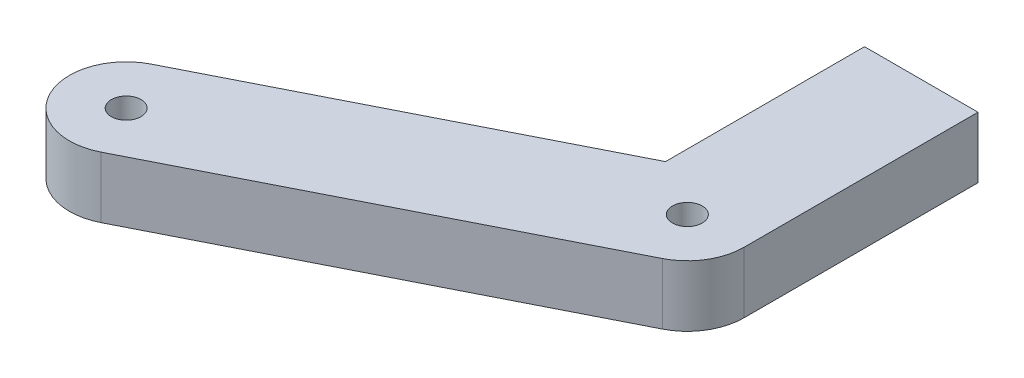
ISO-10303-21;
HEADER;
FILE_DESCRIPTION(('STEP AP214'),'2;1');
FILE_NAME('part.step','',(''),(''),'','','');
FILE_SCHEMA(('AUTOMOTIVE_DESIGN { 1 0 10303 214 1 1 1 1 }'));
ENDSEC;
DATA;
#1=APPLICATION_CONTEXT('core data for automotive mechanical design processes');
#2=APPLICATION_PROTOCOL_DEFINITION('international standard','automotive_design',2000,#1);
#3=PRODUCT_CONTEXT('',#1,'mechanical');
#4=PRODUCT('Part','Part','',(#3));
#5=PRODUCT_RELATED_PRODUCT_CATEGORY('part','',(#4));
#6=PRODUCT_DEFINITION_FORMATION('','',#4);
#7=PRODUCT_DEFINITION_CONTEXT('part definition',#1,'design');
#8=PRODUCT_DEFINITION('design','',#6,#7);
#9=PRODUCT_DEFINITION_SHAPE('','',#8);
#10=(LENGTH_UNIT() NAMED_UNIT(*) SI_UNIT(.MILLI.,.METRE.));
#11=(NAMED_UNIT(*) PLANE_ANGLE_UNIT() SI_UNIT($,.RADIAN.));
#12=(NAMED_UNIT(*) SI_UNIT($,.STERADIAN.) SOLID_ANGLE_UNIT());
#13=UNCERTAINTY_MEASURE_WITH_UNIT(LENGTH_MEASURE(1.E-05),#10,'distance_accuracy_value','');
#14=(GEOMETRIC_REPRESENTATION_CONTEXT(3) GLOBAL_UNCERTAINTY_ASSIGNED_CONTEXT((#13)) GLOBAL_UNIT_ASSIGNED_CONTEXT((#10,
#11,#12)) REPRESENTATION_CONTEXT('',''));
#15=CARTESIAN_POINT('',(0.,0.,0.));
#16=DIRECTION('',(0.,0.,1.));
#17=DIRECTION('',(1.,0.,0.));
#18=AXIS2_PLACEMENT_3D('',#15,#16,#17);
#19=CARTESIAN_POINT('',(-12.4416435833277,7.,-24.6066781381809));
#20=DIRECTION('',(-0.451221813161748,0.,-0.892411830562003));
#21=DIRECTION('',(-0.892411830562003,0.,0.451221813161748));
#22=AXIS2_PLACEMENT_3D('',#19,#20,#21);
#23=PLANE('',#22);
#24=DIRECTION('',(0.892411830562003,0.,-0.451221813161748));
#25=VECTOR('',#24,1.);
#26=CARTESIAN_POINT('',(-12.4416435833277,0.,-24.6066781381809));
#27=LINE('',#26,#25);
#28=CARTESIAN_POINT('',(-11.7902923796233,0.,-24.9360147304082));
#29=VERTEX_POINT('',#28);
#30=CARTESIAN_POINT('',(30.9097076192638,0.,-46.5260147300393));
#31=VERTEX_POINT('',#30);
#32=EDGE_CURVE('E149',#29,#31,#27,.T.);
#33=ORIENTED_EDGE('',*,*,#32,.T.);
#34=DIRECTION('',(0.,-1.,0.));
#35=VECTOR('',#34,1.);
#36=CARTESIAN_POINT('',(30.9097076192638,7.,-46.5260147300393));
#37=LINE('',#36,#35);
#38=CARTESIAN_POINT('',(30.9097076192638,7.,-46.5260147300393));
#39=VERTEX_POINT('',#38);
#40=EDGE_CURVE('E11',#39,#31,#37,.T.);
#41=ORIENTED_EDGE('',*,*,#40,.F.);
#42=DIRECTION('',(0.892411830562003,0.,-0.451221813161748));
#43=VECTOR('',#42,1.);
#44=CARTESIAN_POINT('',(-12.4416435833277,7.,-24.6066781381809));
#45=LINE('',#44,#43);
#46=CARTESIAN_POINT('',(-11.7902923796233,7.,-24.9360147304082));
#47=VERTEX_POINT('',#46);
#48=EDGE_CURVE('E179',#47,#39,#45,.T.);
#49=ORIENTED_EDGE('',*,*,#48,.F.);
#50=DIRECTION('',(0.,-1.,0.));
#51=VECTOR('',#50,1.);
#52=CARTESIAN_POINT('',(-11.7902923796233,7.,-24.9360147304082));
#53=LINE('',#52,#51);
#54=EDGE_CURVE('E148',#47,#29,#53,.T.);
#55=ORIENTED_EDGE('',*,*,#54,.T.);
#56=EDGE_LOOP('',(#33,#41,#49,#55));
#57=FACE_BOUND('',#56,.T.);
#58=ADVANCED_FACE('F47',(#57),#23,.F.);
#59=CARTESIAN_POINT('',(27.9767658337124,7.,-52.3266916286923));
#60=DIRECTION('',(0.,-1.,0.));
#61=DIRECTION('',(0.,0.,-1.));
#62=AXIS2_PLACEMENT_3D('',#59,#60,#61);
#63=CYLINDRICAL_SURFACE('',#62,6.5);
#64=CARTESIAN_POINT('',(27.9767658337124,0.,-52.3266916286923));
#65=DIRECTION('',(0.,1.,0.));
#66=DIRECTION('',(0.,0.,1.));
#67=AXIS2_PLACEMENT_3D('',#64,#65,#66);
#68=CIRCLE('',#67,6.5);
#69=CARTESIAN_POINT('',(34.4767658337124,0.,-52.3266916286923));
#70=VERTEX_POINT('',#69);
#71=EDGE_CURVE('E153',#31,#70,#68,.T.);
#72=ORIENTED_EDGE('',*,*,#71,.T.);
#73=DIRECTION('',(0.,-1.,0.));
#74=VECTOR('',#73,1.);
#75=CARTESIAN_POINT('',(34.4767658337124,7.,-52.3266916286923));
#76=LINE('',#75,#74);
#77=CARTESIAN_POINT('',(34.4767658337124,7.,-52.3266916286923));
#78=VERTEX_POINT('',#77);
#79=EDGE_CURVE('E56',#78,#70,#76,.T.);
#80=ORIENTED_EDGE('',*,*,#79,.F.);
#81=CARTESIAN_POINT('',(27.9767658337124,7.,-52.3266916286923));
#82=DIRECTION('',(0.,1.,0.));
#83=DIRECTION('',(0.,0.,1.));
#84=AXIS2_PLACEMENT_3D('',#81,#82,#83);
#85=CIRCLE('',#84,6.5);
#86=EDGE_CURVE('E100',#39,#78,#85,.T.);
#87=ORIENTED_EDGE('',*,*,#86,.F.);
#88=ORIENTED_EDGE('',*,*,#40,.T.);
#89=EDGE_LOOP('',(#72,#80,#87,#88));
#90=FACE_BOUND('',#89,.T.);
#91=ADVANCED_FACE('F213',(#90),#63,.T.);
#92=CARTESIAN_POINT('',(34.4767658337124,7.,0.));
#93=DIRECTION('',(-1.,0.,0.));
#94=DIRECTION('',(0.,0.,1.));
#95=AXIS2_PLACEMENT_3D('',#92,#93,#94);
#96=PLANE('',#95);
#97=DIRECTION('',(0.,0.,-1.));
#98=VECTOR('',#97,1.);
#99=CARTESIAN_POINT('',(34.4767658337124,0.,0.));
#100=LINE('',#99,#98);
#101=CARTESIAN_POINT('',(34.4767658337124,0.,-79.124442117256));
#102=VERTEX_POINT('',#101);
#103=EDGE_CURVE('E156',#70,#102,#100,.T.);
#104=ORIENTED_EDGE('',*,*,#103,.T.);
#105=DIRECTION('',(0.,-1.,0.));
#106=VECTOR('',#105,1.);
#107=CARTESIAN_POINT('',(34.4767658337124,7.,-79.124442117256));
#108=LINE('',#107,#106);
#109=CARTESIAN_POINT('',(34.4767658337124,7.,-79.124442117256));
#110=VERTEX_POINT('',#109);
#111=EDGE_CURVE('E186',#110,#102,#108,.T.);
#112=ORIENTED_EDGE('',*,*,#111,.F.);
#113=DIRECTION('',(0.,0.,-1.));
#114=VECTOR('',#113,1.);
#115=CARTESIAN_POINT('',(34.4767658337124,7.,0.));
#116=LINE('',#115,#114);
#117=EDGE_CURVE('E195',#78,#110,#116,.T.);
#118=ORIENTED_EDGE('',*,*,#117,.F.);
#119=ORIENTED_EDGE('',*,*,#79,.T.);
#120=EDGE_LOOP('',(#104,#112,#118,#119));
#121=FACE_BOUND('',#120,.T.);
#122=ADVANCED_FACE('F193',(#121),#96,.F.);
#123=CARTESIAN_POINT('',(0.,7.,-79.124442117256));
#124=DIRECTION('',(0.,0.,-1.));
#125=DIRECTION('',(-1.,0.,0.));
#126=AXIS2_PLACEMENT_3D('',#123,#124,#125);
#127=PLANE('',#126);
#128=DIRECTION('',(1.,0.,0.));
#129=VECTOR('',#128,1.);
#130=CARTESIAN_POINT('',(0.,0.,-79.124442117256));
#131=LINE('',#130,#129);
#132=CARTESIAN_POINT('',(21.4767658337124,0.,-79.124442117256));
#133=VERTEX_POINT('',#132);
#134=EDGE_CURVE('E160',#133,#102,#131,.T.);
#135=ORIENTED_EDGE('',*,*,#134,.F.);
#136=DIRECTION('',(0.,-1.,0.));
#137=VECTOR('',#136,1.);
#138=CARTESIAN_POINT('',(21.4767658337124,7.,-79.124442117256));
#139=LINE('',#138,#137);
#140=CARTESIAN_POINT('',(21.4767658337124,7.,-79.124442117256));
#141=VERTEX_POINT('',#140);
#142=EDGE_CURVE('E123',#141,#133,#139,.T.);
#143=ORIENTED_EDGE('',*,*,#142,.F.);
#144=DIRECTION('',(1.,0.,0.));
#145=VECTOR('',#144,1.);
#146=CARTESIAN_POINT('',(0.,7.,-79.124442117256));
#147=LINE('',#146,#145);
#148=EDGE_CURVE('E130',#141,#110,#147,.T.);
#149=ORIENTED_EDGE('',*,*,#148,.T.);
#150=ORIENTED_EDGE('',*,*,#111,.T.);
#151=EDGE_LOOP('',(#135,#143,#149,#150));
#152=FACE_BOUND('',#151,.T.);
#153=ADVANCED_FACE('F202',(#152),#127,.T.);
#154=CARTESIAN_POINT('',(21.4767658337124,7.,0.));
#155=DIRECTION('',(-1.,0.,0.));
#156=DIRECTION('',(0.,0.,1.));
#157=AXIS2_PLACEMENT_3D('',#154,#155,#156);
#158=PLANE('',#157);
#159=DIRECTION('',(0.,0.,-1.));
#160=VECTOR('',#159,1.);
#161=CARTESIAN_POINT('',(21.4767658337124,0.,0.));
#162=LINE('',#161,#160);
#163=CARTESIAN_POINT('',(21.4767658337124,0.,-56.3237903809603));
#164=VERTEX_POINT('',#163);
#165=EDGE_CURVE('E117',#164,#133,#162,.T.);
#166=ORIENTED_EDGE('',*,*,#165,.F.);
#167=DIRECTION('',(0.,-1.,0.));
#168=VECTOR('',#167,1.);
#169=CARTESIAN_POINT('',(21.4767658337124,7.,-56.3237903809603));
#170=LINE('',#169,#168);
#171=CARTESIAN_POINT('',(21.4767658337124,7.,-56.3237903809603));
#172=VERTEX_POINT('',#171);
#173=EDGE_CURVE('E112',#172,#164,#170,.T.);
#174=ORIENTED_EDGE('',*,*,#173,.F.);
#175=DIRECTION('',(0.,0.,-1.));
#176=VECTOR('',#175,1.);
#177=CARTESIAN_POINT('',(21.4767658337124,7.,0.));
#178=LINE('',#177,#176);
#179=EDGE_CURVE('E115',#172,#141,#178,.T.);
#180=ORIENTED_EDGE('',*,*,#179,.T.);
#181=ORIENTED_EDGE('',*,*,#142,.T.);
#182=EDGE_LOOP('',(#166,#174,#180,#181));
#183=FACE_BOUND('',#182,.T.);
#184=ADVANCED_FACE('F114',(#183),#158,.T.);
#185=CARTESIAN_POINT('',(-18.3075271544305,7.,-36.2080319354869));
#186=DIRECTION('',(-0.451221813161747,0.,-0.892411830562003));
#187=DIRECTION('',(-0.892411830562003,0.,0.451221813161747));
#188=AXIS2_PLACEMENT_3D('',#185,#186,#187);
#189=PLANE('',#188);
#190=DIRECTION('',(0.892411830562003,0.,-0.451221813161747));
#191=VECTOR('',#190,1.);
#192=CARTESIAN_POINT('',(-18.3075271544305,0.,-36.2080319354869));
#193=LINE('',#192,#191);
#194=CARTESIAN_POINT('',(-17.656175950726,0.,-36.5373685277142));
#195=VERTEX_POINT('',#194);
#196=EDGE_CURVE('E166',#195,#164,#193,.T.);
#197=ORIENTED_EDGE('',*,*,#196,.F.);
#198=DIRECTION('',(0.,-1.,0.));
#199=VECTOR('',#198,1.);
#200=CARTESIAN_POINT('',(-17.656175950726,7.,-36.5373685277142));
#201=LINE('',#200,#199);
#202=CARTESIAN_POINT('',(-17.656175950726,7.,-36.5373685277142));
#203=VERTEX_POINT('',#202);
#204=EDGE_CURVE('E89',#203,#195,#201,.T.);
#205=ORIENTED_EDGE('',*,*,#204,.F.);
#206=DIRECTION('',(0.892411830562003,0.,-0.451221813161747));
#207=VECTOR('',#206,1.);
#208=CARTESIAN_POINT('',(-18.3075271544305,7.,-36.2080319354869));
#209=LINE('',#208,#207);
#210=EDGE_CURVE('E128',#203,#172,#209,.T.);
#211=ORIENTED_EDGE('',*,*,#210,.T.);
#212=ORIENTED_EDGE('',*,*,#173,.T.);
#213=EDGE_LOOP('',(#197,#205,#211,#212));
#214=FACE_BOUND('',#213,.T.);
#215=ADVANCED_FACE('F133',(#214),#189,.T.);
#216=CARTESIAN_POINT('',(-14.7232341651746,7.,-30.7366916290612));
#217=DIRECTION('',(0.,-1.,0.));
#218=DIRECTION('',(0.,0.,-1.));
#219=AXIS2_PLACEMENT_3D('',#216,#217,#218);
#220=CYLINDRICAL_SURFACE('',#219,1.7);
#221=CARTESIAN_POINT('',(-14.7232341651746,7.,-30.7366916290612));
#222=DIRECTION('',(0.,1.,0.));
#223=DIRECTION('',(0.,0.,1.));
#224=AXIS2_PLACEMENT_3D('',#221,#222,#223);
#225=CIRCLE('',#224,1.7);
#226=CARTESIAN_POINT('',(-14.7232341651746,7.,-29.0366916290612));
#227=VERTEX_POINT('',#226);
#228=EDGE_CURVE('E137',#227,#227,#225,.T.);
#229=ORIENTED_EDGE('',*,*,#228,.T.);
#230=EDGE_LOOP('',(#229));
#231=FACE_BOUND('',#230,.T.);
#232=CARTESIAN_POINT('',(-14.7232341651746,0.,-30.7366916290612));
#233=DIRECTION('',(0.,1.,0.));
#234=DIRECTION('',(0.,0.,1.));
#235=AXIS2_PLACEMENT_3D('',#232,#233,#234);
#236=CIRCLE('',#235,1.7);
#237=CARTESIAN_POINT('',(-14.7232341651746,0.,-29.0366916290612));
#238=VERTEX_POINT('',#237);
#239=EDGE_CURVE('E171',#238,#238,#236,.T.);
#240=ORIENTED_EDGE('',*,*,#239,.F.);
#241=EDGE_LOOP('',(#240));
#242=FACE_BOUND('',#241,.T.);
#243=ADVANCED_FACE('F227',(#231,#242),#220,.F.);
#244=CARTESIAN_POINT('',(-14.7232341651746,7.,-30.7366916290612));
#245=DIRECTION('',(0.,-1.,0.));
#246=DIRECTION('',(0.,0.,-1.));
#247=AXIS2_PLACEMENT_3D('',#244,#245,#246);
#248=CYLINDRICAL_SURFACE('',#247,6.5);
#249=CARTESIAN_POINT('',(-14.7232341651746,0.,-30.7366916290612));
#250=DIRECTION('',(0.,1.,0.));
#251=DIRECTION('',(0.,0.,1.));
#252=AXIS2_PLACEMENT_3D('',#249,#250,#251);
#253=CIRCLE('',#252,6.5);
#254=EDGE_CURVE('E92',#195,#29,#253,.T.);
#255=ORIENTED_EDGE('',*,*,#254,.T.);
#256=ORIENTED_EDGE('',*,*,#54,.F.);
#257=CARTESIAN_POINT('',(-14.7232341651746,7.,-30.7366916290612));
#258=DIRECTION('',(0.,1.,0.));
#259=DIRECTION('',(0.,0.,1.));
#260=AXIS2_PLACEMENT_3D('',#257,#258,#259);
#261=CIRCLE('',#260,6.5);
#262=EDGE_CURVE('E64',#203,#47,#261,.T.);
#263=ORIENTED_EDGE('',*,*,#262,.F.);
#264=ORIENTED_EDGE('',*,*,#204,.T.);
#265=EDGE_LOOP('',(#255,#256,#263,#264));
#266=FACE_BOUND('',#265,.T.);
#267=ADVANCED_FACE('F228',(#266),#248,.T.);
#268=CARTESIAN_POINT('',(27.9767658337124,7.,-52.3266916286923));
#269=DIRECTION('',(0.,-1.,0.));
#270=DIRECTION('',(0.,0.,-1.));
#271=AXIS2_PLACEMENT_3D('',#268,#269,#270);
#272=CYLINDRICAL_SURFACE('',#271,1.7);
#273=CARTESIAN_POINT('',(27.9767658337124,7.,-52.3266916286923));
#274=DIRECTION('',(0.,1.,0.));
#275=DIRECTION('',(0.,0.,1.));
#276=AXIS2_PLACEMENT_3D('',#273,#274,#275);
#277=CIRCLE('',#276,1.7);
#278=CARTESIAN_POINT('',(27.9767658337124,7.,-50.6266916286923));
#279=VERTEX_POINT('',#278);
#280=EDGE_CURVE('E144',#279,#279,#277,.T.);
#281=ORIENTED_EDGE('',*,*,#280,.T.);
#282=EDGE_LOOP('',(#281));
#283=FACE_BOUND('',#282,.T.);
#284=CARTESIAN_POINT('',(27.9767658337124,0.,-52.3266916286923));
#285=DIRECTION('',(0.,1.,0.));
#286=DIRECTION('',(0.,0.,1.));
#287=AXIS2_PLACEMENT_3D('',#284,#285,#286);
#288=CIRCLE('',#287,1.7);
#289=CARTESIAN_POINT('',(27.9767658337124,0.,-50.6266916286923));
#290=VERTEX_POINT('',#289);
#291=EDGE_CURVE('E175',#290,#290,#288,.T.);
#292=ORIENTED_EDGE('',*,*,#291,.F.);
#293=EDGE_LOOP('',(#292));
#294=FACE_BOUND('',#293,.T.);
#295=ADVANCED_FACE('F231',(#283,#294),#272,.F.);
#296=CARTESIAN_POINT('',(0.,7.,0.));
#297=DIRECTION('',(0.,1.,0.));
#298=DIRECTION('',(0.,0.,1.));
#299=AXIS2_PLACEMENT_3D('',#296,#297,#298);
#300=PLANE('',#299);
#301=ORIENTED_EDGE('',*,*,#48,.T.);
#302=ORIENTED_EDGE('',*,*,#86,.T.);
#303=ORIENTED_EDGE('',*,*,#117,.T.);
#304=ORIENTED_EDGE('',*,*,#148,.F.);
#305=ORIENTED_EDGE('',*,*,#179,.F.);
#306=ORIENTED_EDGE('',*,*,#210,.F.);
#307=ORIENTED_EDGE('',*,*,#262,.T.);
#308=EDGE_LOOP('',(#301,#302,#303,#304,#305,#306,#307));
#309=FACE_BOUND('',#308,.T.);
#310=ORIENTED_EDGE('',*,*,#228,.F.);
#311=EDGE_LOOP('',(#310));
#312=FACE_BOUND('',#311,.T.);
#313=ORIENTED_EDGE('',*,*,#280,.F.);
#314=EDGE_LOOP('',(#313));
#315=FACE_BOUND('',#314,.T.);
#316=ADVANCED_FACE('F126',(#309,#312,#315),#300,.T.);
#317=CARTESIAN_POINT('',(0.,0.,0.));
#318=DIRECTION('',(0.,1.,0.));
#319=DIRECTION('',(0.,0.,1.));
#320=AXIS2_PLACEMENT_3D('',#317,#318,#319);
#321=PLANE('',#320);
#322=ORIENTED_EDGE('',*,*,#32,.F.);
#323=ORIENTED_EDGE('',*,*,#254,.F.);
#324=ORIENTED_EDGE('',*,*,#196,.T.);
#325=ORIENTED_EDGE('',*,*,#165,.T.);
#326=ORIENTED_EDGE('',*,*,#134,.T.);
#327=ORIENTED_EDGE('',*,*,#103,.F.);
#328=ORIENTED_EDGE('',*,*,#71,.F.);
#329=EDGE_LOOP('',(#322,#323,#324,#325,#326,#327,#328));
#330=FACE_BOUND('',#329,.T.);
#331=ORIENTED_EDGE('',*,*,#239,.T.);
#332=EDGE_LOOP('',(#331));
#333=FACE_BOUND('',#332,.T.);
#334=ORIENTED_EDGE('',*,*,#291,.T.);
#335=EDGE_LOOP('',(#334));
#336=FACE_BOUND('',#335,.T.);
#337=ADVANCED_FACE('F198',(#330,#333,#336),#321,.F.);
#338=CLOSED_SHELL('',(#58,#91,#122,#153,#184,#215,#243,#267,#295,#316,#337));
#339=MANIFOLD_SOLID_BREP('B2',#338);
#340=ADVANCED_BREP_SHAPE_REPRESENTATION('',(#18,#339),#14);
#341=SHAPE_DEFINITION_REPRESENTATION(#9,#340);
ENDSEC;
END-ISO-10303-21;
